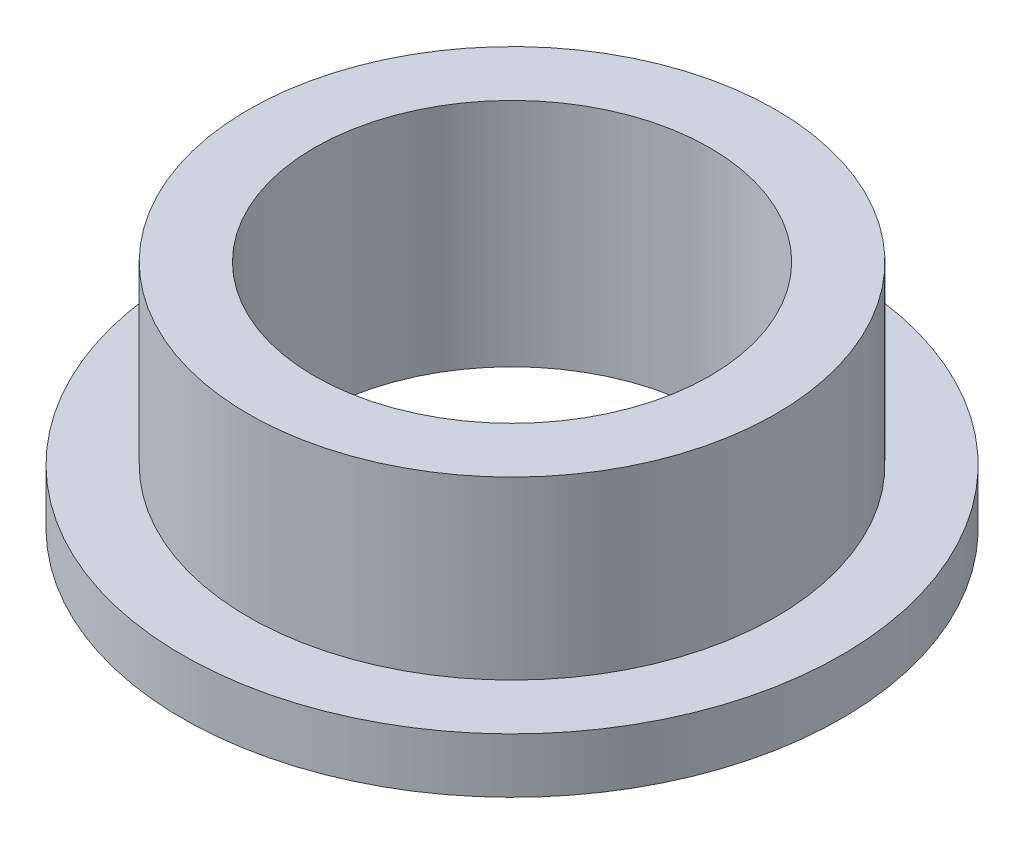
ISO-10303-21;
HEADER;
FILE_DESCRIPTION(('STEP AP214'),'2;1');
FILE_NAME('part.step','',(''),(''),'','','');
FILE_SCHEMA(('AUTOMOTIVE_DESIGN { 1 0 10303 214 1 1 1 1 }'));
ENDSEC;
DATA;
#1=APPLICATION_CONTEXT('core data for automotive mechanical design processes');
#2=APPLICATION_PROTOCOL_DEFINITION('international standard','automotive_design',2000,#1);
#3=PRODUCT_CONTEXT('',#1,'mechanical');
#4=PRODUCT('Part','Part','',(#3));
#5=PRODUCT_RELATED_PRODUCT_CATEGORY('part','',(#4));
#6=PRODUCT_DEFINITION_FORMATION('','',#4);
#7=PRODUCT_DEFINITION_CONTEXT('part definition',#1,'design');
#8=PRODUCT_DEFINITION('design','',#6,#7);
#9=PRODUCT_DEFINITION_SHAPE('','',#8);
#10=(LENGTH_UNIT() NAMED_UNIT(*) SI_UNIT(.MILLI.,.METRE.));
#11=(NAMED_UNIT(*) PLANE_ANGLE_UNIT() SI_UNIT($,.RADIAN.));
#12=(NAMED_UNIT(*) SI_UNIT($,.STERADIAN.) SOLID_ANGLE_UNIT());
#13=UNCERTAINTY_MEASURE_WITH_UNIT(LENGTH_MEASURE(1.E-05),#10,'distance_accuracy_value','');
#14=(GEOMETRIC_REPRESENTATION_CONTEXT(3) GLOBAL_UNCERTAINTY_ASSIGNED_CONTEXT((#13)) GLOBAL_UNIT_ASSIGNED_CONTEXT((#10,
#11,#12)) REPRESENTATION_CONTEXT('',''));
#15=CARTESIAN_POINT('',(0.,0.,0.));
#16=DIRECTION('',(0.,0.,1.));
#17=DIRECTION('',(1.,0.,0.));
#18=AXIS2_PLACEMENT_3D('',#15,#16,#17);
#19=CARTESIAN_POINT('',(30.,0.,0.));
#20=DIRECTION('',(0.,-1.,0.));
#21=DIRECTION('',(0.,0.,-1.));
#22=AXIS2_PLACEMENT_3D('',#19,#20,#21);
#23=PLANE('',#22);
#24=CARTESIAN_POINT('',(0.,0.,0.));
#25=DIRECTION('',(0.,-1.,0.));
#26=DIRECTION('',(0.,0.,-1.));
#27=AXIS2_PLACEMENT_3D('',#24,#25,#26);
#28=CIRCLE('',#27,30.);
#29=CARTESIAN_POINT('',(0.,0.,-30.));
#30=VERTEX_POINT('',#29);
#31=EDGE_CURVE('E59',#30,#30,#28,.T.);
#32=ORIENTED_EDGE('',*,*,#31,.T.);
#33=EDGE_LOOP('',(#32));
#34=FACE_BOUND('',#33,.T.);
#35=CARTESIAN_POINT('',(0.,0.,0.));
#36=DIRECTION('',(0.,-1.,0.));
#37=DIRECTION('',(0.,0.,-1.));
#38=AXIS2_PLACEMENT_3D('',#35,#36,#37);
#39=CIRCLE('',#38,18.);
#40=CARTESIAN_POINT('',(0.,0.,-18.));
#41=VERTEX_POINT('',#40);
#42=EDGE_CURVE('E10',#41,#41,#39,.T.);
#43=ORIENTED_EDGE('',*,*,#42,.F.);
#44=EDGE_LOOP('',(#43));
#45=FACE_BOUND('',#44,.T.);
#46=ADVANCED_FACE('F37',(#34,#45),#23,.T.);
#47=CARTESIAN_POINT('',(0.,0.,0.));
#48=DIRECTION('',(0.,-1.,0.));
#49=DIRECTION('',(0.,0.,-1.));
#50=AXIS2_PLACEMENT_3D('',#47,#48,#49);
#51=CYLINDRICAL_SURFACE('',#50,18.);
#52=ORIENTED_EDGE('',*,*,#42,.T.);
#53=EDGE_LOOP('',(#52));
#54=FACE_BOUND('',#53,.T.);
#55=CARTESIAN_POINT('',(0.,21.,0.));
#56=DIRECTION('',(0.,-1.,0.));
#57=DIRECTION('',(0.,0.,-1.));
#58=AXIS2_PLACEMENT_3D('',#55,#56,#57);
#59=CIRCLE('',#58,18.);
#60=CARTESIAN_POINT('',(0.,21.,-18.));
#61=VERTEX_POINT('',#60);
#62=EDGE_CURVE('E43',#61,#61,#59,.T.);
#63=ORIENTED_EDGE('',*,*,#62,.F.);
#64=EDGE_LOOP('',(#63));
#65=FACE_BOUND('',#64,.T.);
#66=ADVANCED_FACE('F77',(#54,#65),#51,.F.);
#67=CARTESIAN_POINT('',(18.,21.,0.));
#68=DIRECTION('',(0.,1.,0.));
#69=DIRECTION('',(0.,0.,1.));
#70=AXIS2_PLACEMENT_3D('',#67,#68,#69);
#71=PLANE('',#70);
#72=ORIENTED_EDGE('',*,*,#62,.T.);
#73=EDGE_LOOP('',(#72));
#74=FACE_BOUND('',#73,.T.);
#75=CARTESIAN_POINT('',(0.,21.,0.));
#76=DIRECTION('',(0.,-1.,0.));
#77=DIRECTION('',(0.,0.,-1.));
#78=AXIS2_PLACEMENT_3D('',#75,#76,#77);
#79=CIRCLE('',#78,24.);
#80=CARTESIAN_POINT('',(0.,21.,-24.));
#81=VERTEX_POINT('',#80);
#82=EDGE_CURVE('E47',#81,#81,#79,.T.);
#83=ORIENTED_EDGE('',*,*,#82,.F.);
#84=EDGE_LOOP('',(#83));
#85=FACE_BOUND('',#84,.T.);
#86=ADVANCED_FACE('F81',(#74,#85),#71,.T.);
#87=CARTESIAN_POINT('',(0.,0.,0.));
#88=DIRECTION('',(0.,-1.,0.));
#89=DIRECTION('',(0.,0.,-1.));
#90=AXIS2_PLACEMENT_3D('',#87,#88,#89);
#91=CYLINDRICAL_SURFACE('',#90,24.);
#92=ORIENTED_EDGE('',*,*,#82,.T.);
#93=EDGE_LOOP('',(#92));
#94=FACE_BOUND('',#93,.T.);
#95=CARTESIAN_POINT('',(0.,5.,0.));
#96=DIRECTION('',(0.,-1.,0.));
#97=DIRECTION('',(0.,0.,-1.));
#98=AXIS2_PLACEMENT_3D('',#95,#96,#97);
#99=CIRCLE('',#98,24.);
#100=CARTESIAN_POINT('',(0.,5.,-24.));
#101=VERTEX_POINT('',#100);
#102=EDGE_CURVE('E51',#101,#101,#99,.T.);
#103=ORIENTED_EDGE('',*,*,#102,.F.);
#104=EDGE_LOOP('',(#103));
#105=FACE_BOUND('',#104,.T.);
#106=ADVANCED_FACE('F73',(#94,#105),#91,.T.);
#107=CARTESIAN_POINT('',(24.,5.,0.));
#108=DIRECTION('',(0.,1.,0.));
#109=DIRECTION('',(0.,0.,1.));
#110=AXIS2_PLACEMENT_3D('',#107,#108,#109);
#111=PLANE('',#110);
#112=ORIENTED_EDGE('',*,*,#102,.T.);
#113=EDGE_LOOP('',(#112));
#114=FACE_BOUND('',#113,.T.);
#115=CARTESIAN_POINT('',(0.,5.,0.));
#116=DIRECTION('',(0.,-1.,0.));
#117=DIRECTION('',(0.,0.,-1.));
#118=AXIS2_PLACEMENT_3D('',#115,#116,#117);
#119=CIRCLE('',#118,30.);
#120=CARTESIAN_POINT('',(0.,5.,-30.));
#121=VERTEX_POINT('',#120);
#122=EDGE_CURVE('E56',#121,#121,#119,.T.);
#123=ORIENTED_EDGE('',*,*,#122,.F.);
#124=EDGE_LOOP('',(#123));
#125=FACE_BOUND('',#124,.T.);
#126=ADVANCED_FACE('F67',(#114,#125),#111,.T.);
#127=CARTESIAN_POINT('',(0.,0.,0.));
#128=DIRECTION('',(0.,-1.,0.));
#129=DIRECTION('',(0.,0.,-1.));
#130=AXIS2_PLACEMENT_3D('',#127,#128,#129);
#131=CYLINDRICAL_SURFACE('',#130,30.);
#132=ORIENTED_EDGE('',*,*,#122,.T.);
#133=EDGE_LOOP('',(#132));
#134=FACE_BOUND('',#133,.T.);
#135=ORIENTED_EDGE('',*,*,#31,.F.);
#136=EDGE_LOOP('',(#135));
#137=FACE_BOUND('',#136,.T.);
#138=ADVANCED_FACE('F65',(#134,#137),#131,.T.);
#139=CLOSED_SHELL('',(#46,#66,#86,#106,#126,#138));
#140=MANIFOLD_SOLID_BREP('B2',#139);
#141=ADVANCED_BREP_SHAPE_REPRESENTATION('',(#18,#140),#14);
#142=SHAPE_DEFINITION_REPRESENTATION(#9,#141);
ENDSEC;
END-ISO-10303-21;
